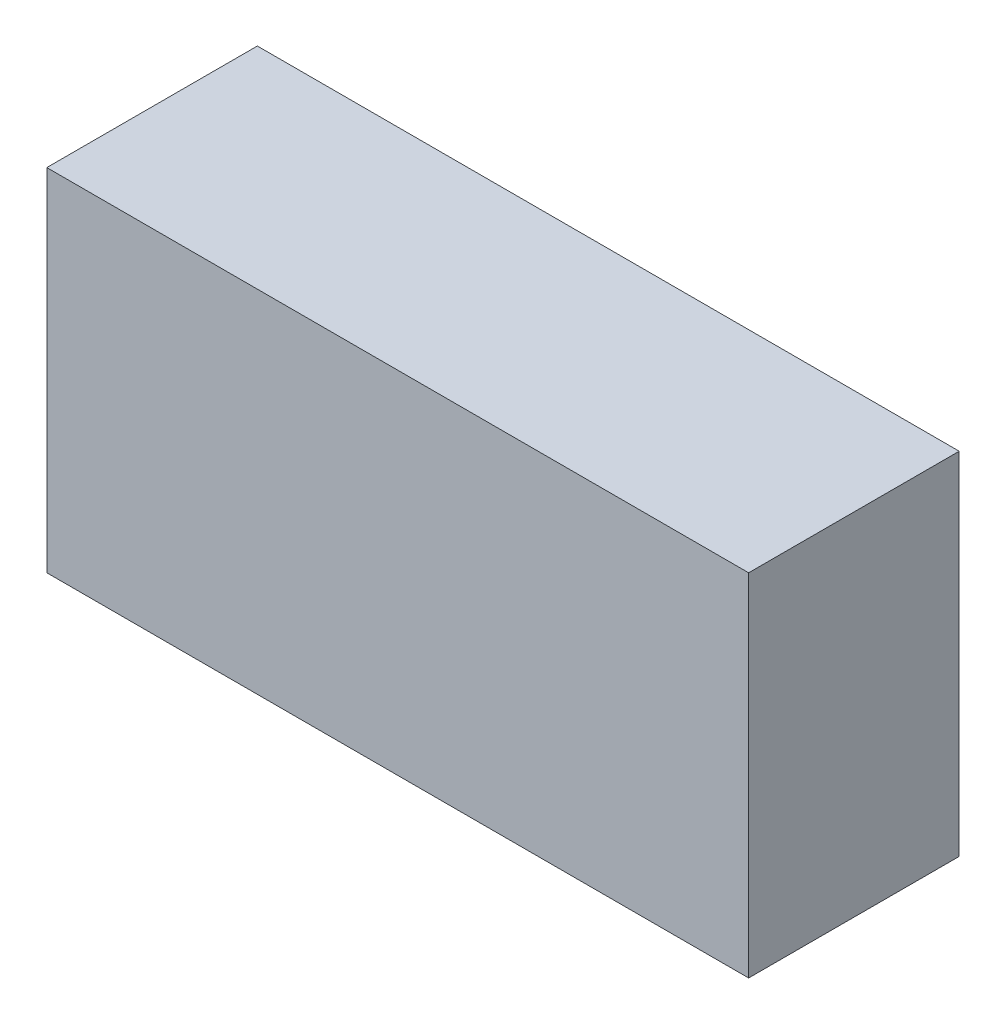
ISO-10303-21;
HEADER;
FILE_DESCRIPTION(('STEP AP214'),'2;1');
FILE_NAME('part.step','',(''),(''),'','','');
FILE_SCHEMA(('AUTOMOTIVE_DESIGN { 1 0 10303 214 1 1 1 1 }'));
ENDSEC;
DATA;
#1=APPLICATION_CONTEXT('core data for automotive mechanical design processes');
#2=APPLICATION_PROTOCOL_DEFINITION('international standard','automotive_design',2000,#1);
#3=PRODUCT_CONTEXT('',#1,'mechanical');
#4=PRODUCT('Part','Part','',(#3));
#5=PRODUCT_RELATED_PRODUCT_CATEGORY('part','',(#4));
#6=PRODUCT_DEFINITION_FORMATION('','',#4);
#7=PRODUCT_DEFINITION_CONTEXT('part definition',#1,'design');
#8=PRODUCT_DEFINITION('design','',#6,#7);
#9=PRODUCT_DEFINITION_SHAPE('','',#8);
#10=(LENGTH_UNIT() NAMED_UNIT(*) SI_UNIT(.MILLI.,.METRE.));
#11=(NAMED_UNIT(*) PLANE_ANGLE_UNIT() SI_UNIT($,.RADIAN.));
#12=(NAMED_UNIT(*) SI_UNIT($,.STERADIAN.) SOLID_ANGLE_UNIT());
#13=UNCERTAINTY_MEASURE_WITH_UNIT(LENGTH_MEASURE(1.E-05),#10,'distance_accuracy_value','');
#14=(GEOMETRIC_REPRESENTATION_CONTEXT(3) GLOBAL_UNCERTAINTY_ASSIGNED_CONTEXT((#13)) GLOBAL_UNIT_ASSIGNED_CONTEXT((#10,
#11,#12)) REPRESENTATION_CONTEXT('',''));
#15=CARTESIAN_POINT('',(0.,0.,0.));
#16=DIRECTION('',(0.,0.,1.));
#17=DIRECTION('',(1.,0.,0.));
#18=AXIS2_PLACEMENT_3D('',#15,#16,#17);
#19=CARTESIAN_POINT('',(-10.,-5.,6.));
#20=DIRECTION('',(1.,0.,0.));
#21=DIRECTION('',(0.,0.,-1.));
#22=AXIS2_PLACEMENT_3D('',#19,#20,#21);
#23=PLANE('',#22);
#24=DIRECTION('',(0.,-1.,0.));
#25=VECTOR('',#24,1.);
#26=CARTESIAN_POINT('',(-10.,-5.,0.));
#27=LINE('',#26,#25);
#28=CARTESIAN_POINT('',(-10.,5.,0.));
#29=VERTEX_POINT('',#28);
#30=CARTESIAN_POINT('',(-10.,-5.,0.));
#31=VERTEX_POINT('',#30);
#32=EDGE_CURVE('E102',#29,#31,#27,.T.);
#33=ORIENTED_EDGE('',*,*,#32,.T.);
#34=DIRECTION('',(0.,0.,-1.));
#35=VECTOR('',#34,1.);
#36=CARTESIAN_POINT('',(-10.,-5.,6.));
#37=LINE('',#36,#35);
#38=CARTESIAN_POINT('',(-10.,-5.,6.));
#39=VERTEX_POINT('',#38);
#40=EDGE_CURVE('E11',#39,#31,#37,.T.);
#41=ORIENTED_EDGE('',*,*,#40,.F.);
#42=DIRECTION('',(0.,-1.,0.));
#43=VECTOR('',#42,1.);
#44=CARTESIAN_POINT('',(-10.,-5.,6.));
#45=LINE('',#44,#43);
#46=CARTESIAN_POINT('',(-10.,5.,6.));
#47=VERTEX_POINT('',#46);
#48=EDGE_CURVE('E90',#47,#39,#45,.T.);
#49=ORIENTED_EDGE('',*,*,#48,.F.);
#50=DIRECTION('',(0.,0.,-1.));
#51=VECTOR('',#50,1.);
#52=CARTESIAN_POINT('',(-10.,5.,6.));
#53=LINE('',#52,#51);
#54=EDGE_CURVE('E98',#47,#29,#53,.T.);
#55=ORIENTED_EDGE('',*,*,#54,.T.);
#56=EDGE_LOOP('',(#33,#41,#49,#55));
#57=FACE_BOUND('',#56,.T.);
#58=ADVANCED_FACE('F39',(#57),#23,.F.);
#59=CARTESIAN_POINT('',(-10.,-5.,6.));
#60=DIRECTION('',(0.,1.,0.));
#61=DIRECTION('',(0.,0.,1.));
#62=AXIS2_PLACEMENT_3D('',#59,#60,#61);
#63=PLANE('',#62);
#64=DIRECTION('',(1.,0.,0.));
#65=VECTOR('',#64,1.);
#66=CARTESIAN_POINT('',(-10.,-5.,0.));
#67=LINE('',#66,#65);
#68=CARTESIAN_POINT('',(10.,-5.,0.));
#69=VERTEX_POINT('',#68);
#70=EDGE_CURVE('E94',#31,#69,#67,.T.);
#71=ORIENTED_EDGE('',*,*,#70,.T.);
#72=DIRECTION('',(0.,0.,-1.));
#73=VECTOR('',#72,1.);
#74=CARTESIAN_POINT('',(10.,-5.,6.));
#75=LINE('',#74,#73);
#76=CARTESIAN_POINT('',(10.,-5.,6.));
#77=VERTEX_POINT('',#76);
#78=EDGE_CURVE('E47',#77,#69,#75,.T.);
#79=ORIENTED_EDGE('',*,*,#78,.F.);
#80=DIRECTION('',(1.,0.,0.));
#81=VECTOR('',#80,1.);
#82=CARTESIAN_POINT('',(-10.,-5.,6.));
#83=LINE('',#82,#81);
#84=EDGE_CURVE('E85',#39,#77,#83,.T.);
#85=ORIENTED_EDGE('',*,*,#84,.F.);
#86=ORIENTED_EDGE('',*,*,#40,.T.);
#87=EDGE_LOOP('',(#71,#79,#85,#86));
#88=FACE_BOUND('',#87,.T.);
#89=ADVANCED_FACE('F93',(#88),#63,.F.);
#90=CARTESIAN_POINT('',(10.,-5.,6.));
#91=DIRECTION('',(-1.,0.,0.));
#92=DIRECTION('',(0.,0.,1.));
#93=AXIS2_PLACEMENT_3D('',#90,#91,#92);
#94=PLANE('',#93);
#95=DIRECTION('',(0.,1.,0.));
#96=VECTOR('',#95,1.);
#97=CARTESIAN_POINT('',(10.,-5.,0.));
#98=LINE('',#97,#96);
#99=CARTESIAN_POINT('',(10.,5.,0.));
#100=VERTEX_POINT('',#99);
#101=EDGE_CURVE('E72',#69,#100,#98,.T.);
#102=ORIENTED_EDGE('',*,*,#101,.T.);
#103=DIRECTION('',(0.,0.,-1.));
#104=VECTOR('',#103,1.);
#105=CARTESIAN_POINT('',(10.,5.,6.));
#106=LINE('',#105,#104);
#107=CARTESIAN_POINT('',(10.,5.,6.));
#108=VERTEX_POINT('',#107);
#109=EDGE_CURVE('E95',#108,#100,#106,.T.);
#110=ORIENTED_EDGE('',*,*,#109,.F.);
#111=DIRECTION('',(0.,1.,0.));
#112=VECTOR('',#111,1.);
#113=CARTESIAN_POINT('',(10.,-5.,6.));
#114=LINE('',#113,#112);
#115=EDGE_CURVE('E88',#77,#108,#114,.T.);
#116=ORIENTED_EDGE('',*,*,#115,.F.);
#117=ORIENTED_EDGE('',*,*,#78,.T.);
#118=EDGE_LOOP('',(#102,#110,#116,#117));
#119=FACE_BOUND('',#118,.T.);
#120=ADVANCED_FACE('F96',(#119),#94,.F.);
#121=CARTESIAN_POINT('',(-10.,5.,6.));
#122=DIRECTION('',(0.,-1.,0.));
#123=DIRECTION('',(0.,0.,-1.));
#124=AXIS2_PLACEMENT_3D('',#121,#122,#123);
#125=PLANE('',#124);
#126=DIRECTION('',(-1.,0.,0.));
#127=VECTOR('',#126,1.);
#128=CARTESIAN_POINT('',(-10.,5.,0.));
#129=LINE('',#128,#127);
#130=EDGE_CURVE('E78',#100,#29,#129,.T.);
#131=ORIENTED_EDGE('',*,*,#130,.T.);
#132=ORIENTED_EDGE('',*,*,#54,.F.);
#133=DIRECTION('',(-1.,0.,0.));
#134=VECTOR('',#133,1.);
#135=CARTESIAN_POINT('',(-10.,5.,6.));
#136=LINE('',#135,#134);
#137=EDGE_CURVE('E55',#108,#47,#136,.T.);
#138=ORIENTED_EDGE('',*,*,#137,.F.);
#139=ORIENTED_EDGE('',*,*,#109,.T.);
#140=EDGE_LOOP('',(#131,#132,#138,#139));
#141=FACE_BOUND('',#140,.T.);
#142=ADVANCED_FACE('F109',(#141),#125,.F.);
#143=CARTESIAN_POINT('',(0.,0.,6.));
#144=DIRECTION('',(0.,0.,-1.));
#145=DIRECTION('',(-1.,0.,0.));
#146=AXIS2_PLACEMENT_3D('',#143,#144,#145);
#147=PLANE('',#146);
#148=ORIENTED_EDGE('',*,*,#48,.T.);
#149=ORIENTED_EDGE('',*,*,#84,.T.);
#150=ORIENTED_EDGE('',*,*,#115,.T.);
#151=ORIENTED_EDGE('',*,*,#137,.T.);
#152=EDGE_LOOP('',(#148,#149,#150,#151));
#153=FACE_BOUND('',#152,.T.);
#154=ADVANCED_FACE('F86',(#153),#147,.F.);
#155=CARTESIAN_POINT('',(0.,0.,0.));
#156=DIRECTION('',(0.,0.,-1.));
#157=DIRECTION('',(-1.,0.,0.));
#158=AXIS2_PLACEMENT_3D('',#155,#156,#157);
#159=PLANE('',#158);
#160=ORIENTED_EDGE('',*,*,#32,.F.);
#161=ORIENTED_EDGE('',*,*,#130,.F.);
#162=ORIENTED_EDGE('',*,*,#101,.F.);
#163=ORIENTED_EDGE('',*,*,#70,.F.);
#164=EDGE_LOOP('',(#160,#161,#162,#163));
#165=FACE_BOUND('',#164,.T.);
#166=ADVANCED_FACE('F112',(#165),#159,.T.);
#167=CLOSED_SHELL('',(#58,#89,#120,#142,#154,#166));
#168=MANIFOLD_SOLID_BREP('B2',#167);
#169=ADVANCED_BREP_SHAPE_REPRESENTATION('',(#18,#168),#14);
#170=SHAPE_DEFINITION_REPRESENTATION(#9,#169);
ENDSEC;
END-ISO-10303-21;
